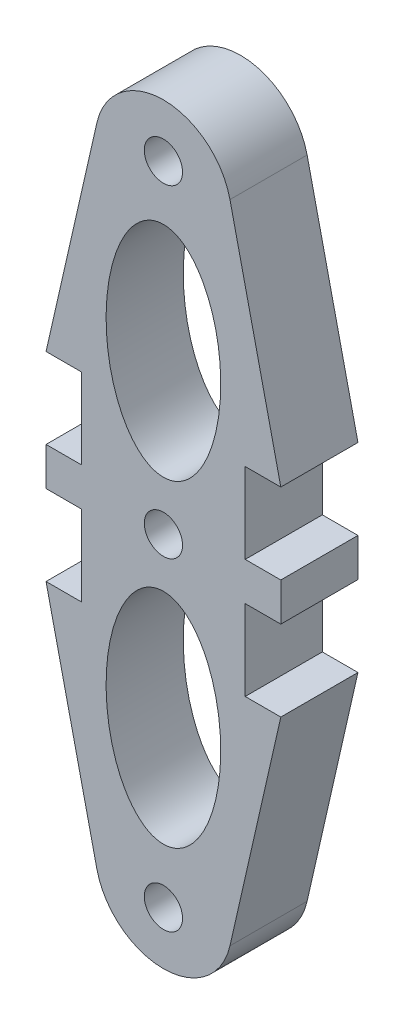
ISO-10303-21;
HEADER;
FILE_DESCRIPTION(('STEP AP214'),'2;1');
FILE_NAME('part.step','',(''),(''),'','','');
FILE_SCHEMA(('AUTOMOTIVE_DESIGN { 1 0 10303 214 1 1 1 1 }'));
ENDSEC;
DATA;
#1=APPLICATION_CONTEXT('core data for automotive mechanical design processes');
#2=APPLICATION_PROTOCOL_DEFINITION('international standard','automotive_design',2000,#1);
#3=PRODUCT_CONTEXT('',#1,'mechanical');
#4=PRODUCT('Part','Part','',(#3));
#5=PRODUCT_RELATED_PRODUCT_CATEGORY('part','',(#4));
#6=PRODUCT_DEFINITION_FORMATION('','',#4);
#7=PRODUCT_DEFINITION_CONTEXT('part definition',#1,'design');
#8=PRODUCT_DEFINITION('design','',#6,#7);
#9=PRODUCT_DEFINITION_SHAPE('','',#8);
#10=(LENGTH_UNIT() NAMED_UNIT(*) SI_UNIT(.MILLI.,.METRE.));
#11=(NAMED_UNIT(*) PLANE_ANGLE_UNIT() SI_UNIT($,.RADIAN.));
#12=(NAMED_UNIT(*) SI_UNIT($,.STERADIAN.) SOLID_ANGLE_UNIT());
#13=UNCERTAINTY_MEASURE_WITH_UNIT(LENGTH_MEASURE(1.E-05),#10,'distance_accuracy_value','');
#14=(GEOMETRIC_REPRESENTATION_CONTEXT(3) GLOBAL_UNCERTAINTY_ASSIGNED_CONTEXT((#13)) GLOBAL_UNIT_ASSIGNED_CONTEXT((#10,
#11,#12)) REPRESENTATION_CONTEXT('',''));
#15=CARTESIAN_POINT('',(0.,0.,0.));
#16=DIRECTION('',(0.,0.,1.));
#17=DIRECTION('',(1.,0.,0.));
#18=AXIS2_PLACEMENT_3D('',#15,#16,#17);
#19=CARTESIAN_POINT('',(839.03473715538,190.817587361382,5.85));
#20=DIRECTION('',(0.975100729071147,0.221762413778613,0.));
#21=DIRECTION('',(-0.221762413778613,0.975100729071147,0.));
#22=AXIS2_PLACEMENT_3D('',#19,#20,#21);
#23=PLANE('',#22);
#24=DIRECTION('',(0.221762413778613,-0.975100729071147,0.));
#25=VECTOR('',#24,1.);
#26=CARTESIAN_POINT('',(839.03473715538,190.817587361382,0.));
#27=LINE('',#26,#25);
#28=CARTESIAN_POINT('',(778.759168708765,455.852359196733,0.));
#29=VERTEX_POINT('',#28);
#30=CARTESIAN_POINT('',(782.614024726695,438.902359196733,0.));
#31=VERTEX_POINT('',#30);
#32=EDGE_CURVE('E324',#29,#31,#27,.T.);
#33=ORIENTED_EDGE('',*,*,#32,.T.);
#34=DIRECTION('',(0.,0.,-1.));
#35=VECTOR('',#34,1.);
#36=CARTESIAN_POINT('',(782.614024726695,438.902359196733,5.85));
#37=LINE('',#36,#35);
#38=CARTESIAN_POINT('',(782.614024726695,438.902359196733,5.85));
#39=VERTEX_POINT('',#38);
#40=EDGE_CURVE('E13',#39,#31,#37,.T.);
#41=ORIENTED_EDGE('',*,*,#40,.F.);
#42=DIRECTION('',(0.221762413778613,-0.975100729071147,0.));
#43=VECTOR('',#42,1.);
#44=CARTESIAN_POINT('',(839.03473715538,190.817587361382,5.85));
#45=LINE('',#44,#43);
#46=CARTESIAN_POINT('',(778.759168708765,455.852359196733,5.85));
#47=VERTEX_POINT('',#46);
#48=EDGE_CURVE('E479',#47,#39,#45,.T.);
#49=ORIENTED_EDGE('',*,*,#48,.F.);
#50=DIRECTION('',(0.,0.,-1.));
#51=VECTOR('',#50,1.);
#52=CARTESIAN_POINT('',(778.759168708765,455.852359196733,5.85));
#53=LINE('',#52,#51);
#54=EDGE_CURVE('E389',#47,#29,#53,.T.);
#55=ORIENTED_EDGE('',*,*,#54,.T.);
#56=EDGE_LOOP('',(#33,#41,#49,#55));
#57=FACE_BOUND('',#56,.T.);
#58=ADVANCED_FACE('F45',(#57),#23,.F.);
#59=CARTESIAN_POINT('',(787.659168708765,440.049751741901,5.85));
#60=DIRECTION('',(0.,0.,-1.));
#61=DIRECTION('',(-1.,0.,0.));
#62=AXIS2_PLACEMENT_3D('',#59,#60,#61);
#63=CYLINDRICAL_SURFACE('',#62,5.17397211555386);
#64=CARTESIAN_POINT('',(787.659168708765,440.049751741901,0.));
#65=DIRECTION('',(0.,0.,1.));
#66=DIRECTION('',(1.,0.,0.));
#67=AXIS2_PLACEMENT_3D('',#64,#65,#66);
#68=CIRCLE('',#67,5.17397211555386);
#69=CARTESIAN_POINT('',(792.704312690836,438.902359196733,0.));
#70=VERTEX_POINT('',#69);
#71=EDGE_CURVE('E328',#31,#70,#68,.T.);
#72=ORIENTED_EDGE('',*,*,#71,.T.);
#73=DIRECTION('',(0.,0.,-1.));
#74=VECTOR('',#73,1.);
#75=CARTESIAN_POINT('',(792.704312690836,438.902359196733,5.85));
#76=LINE('',#75,#74);
#77=CARTESIAN_POINT('',(792.704312690836,438.902359196733,5.85));
#78=VERTEX_POINT('',#77);
#79=EDGE_CURVE('E54',#78,#70,#76,.T.);
#80=ORIENTED_EDGE('',*,*,#79,.F.);
#81=CARTESIAN_POINT('',(787.659168708765,440.049751741901,5.85));
#82=DIRECTION('',(0.,0.,1.));
#83=DIRECTION('',(1.,0.,0.));
#84=AXIS2_PLACEMENT_3D('',#81,#82,#83);
#85=CIRCLE('',#84,5.17397211555386);
#86=EDGE_CURVE('E140',#39,#78,#85,.T.);
#87=ORIENTED_EDGE('',*,*,#86,.F.);
#88=ORIENTED_EDGE('',*,*,#40,.T.);
#89=EDGE_LOOP('',(#72,#80,#87,#88));
#90=FACE_BOUND('',#89,.T.);
#91=ADVANCED_FACE('F304',(#90),#63,.T.);
#92=CARTESIAN_POINT('',(658.81170002402,-149.830339027732,5.85));
#93=DIRECTION('',(-0.975100729071147,0.221762413778613,0.));
#94=DIRECTION('',(-0.221762413778613,-0.975100729071147,0.));
#95=AXIS2_PLACEMENT_3D('',#92,#93,#94);
#96=PLANE('',#95);
#97=DIRECTION('',(0.221762413778613,0.975100729071147,0.));
#98=VECTOR('',#97,1.);
#99=CARTESIAN_POINT('',(658.81170002402,-149.830339027732,0.));
#100=LINE('',#99,#98);
#101=CARTESIAN_POINT('',(796.559168708765,455.852359196733,0.));
#102=VERTEX_POINT('',#101);
#103=EDGE_CURVE('E333',#70,#102,#100,.T.);
#104=ORIENTED_EDGE('',*,*,#103,.T.);
#105=DIRECTION('',(0.,0.,-1.));
#106=VECTOR('',#105,1.);
#107=CARTESIAN_POINT('',(796.559168708765,455.852359196733,5.85));
#108=LINE('',#107,#106);
#109=CARTESIAN_POINT('',(796.559168708765,455.852359196733,5.85));
#110=VERTEX_POINT('',#109);
#111=EDGE_CURVE('E421',#110,#102,#108,.T.);
#112=ORIENTED_EDGE('',*,*,#111,.F.);
#113=DIRECTION('',(0.221762413778613,0.975100729071147,0.));
#114=VECTOR('',#113,1.);
#115=CARTESIAN_POINT('',(658.81170002402,-149.830339027732,5.85));
#116=LINE('',#115,#114);
#117=EDGE_CURVE('E426',#78,#110,#116,.T.);
#118=ORIENTED_EDGE('',*,*,#117,.F.);
#119=ORIENTED_EDGE('',*,*,#79,.T.);
#120=EDGE_LOOP('',(#104,#112,#118,#119));
#121=FACE_BOUND('',#120,.T.);
#122=ADVANCED_FACE('F300',(#121),#96,.F.);
#123=CARTESIAN_POINT('',(9.37218120388744E-12,455.852359196749,5.85));
#124=DIRECTION('',(0.,1.,0.));
#125=DIRECTION('',(-1.,0.,0.));
#126=AXIS2_PLACEMENT_3D('',#123,#124,#125);
#127=PLANE('',#126);
#128=DIRECTION('',(1.,0.,0.));
#129=VECTOR('',#128,1.);
#130=CARTESIAN_POINT('',(9.37218120388744E-12,455.852359196749,0.));
#131=LINE('',#130,#129);
#132=CARTESIAN_POINT('',(793.859168708765,455.852359196733,0.));
#133=VERTEX_POINT('',#132);
#134=EDGE_CURVE('E336',#133,#102,#131,.T.);
#135=ORIENTED_EDGE('',*,*,#134,.F.);
#136=DIRECTION('',(0.,0.,-1.));
#137=VECTOR('',#136,1.);
#138=CARTESIAN_POINT('',(793.859168708765,455.852359196733,5.85));
#139=LINE('',#138,#137);
#140=CARTESIAN_POINT('',(793.859168708765,455.852359196733,5.85));
#141=VERTEX_POINT('',#140);
#142=EDGE_CURVE('E419',#141,#133,#139,.T.);
#143=ORIENTED_EDGE('',*,*,#142,.F.);
#144=DIRECTION('',(1.,0.,0.));
#145=VECTOR('',#144,1.);
#146=CARTESIAN_POINT('',(9.37218120388744E-12,455.852359196749,5.85));
#147=LINE('',#146,#145);
#148=EDGE_CURVE('E436',#141,#110,#147,.T.);
#149=ORIENTED_EDGE('',*,*,#148,.T.);
#150=ORIENTED_EDGE('',*,*,#111,.T.);
#151=EDGE_LOOP('',(#135,#143,#149,#150));
#152=FACE_BOUND('',#151,.T.);
#153=ADVANCED_FACE('F296',(#152),#127,.T.);
#154=CARTESIAN_POINT('',(793.859168708765,0.,5.85));
#155=DIRECTION('',(1.,0.,0.));
#156=DIRECTION('',(0.,0.,-1.));
#157=AXIS2_PLACEMENT_3D('',#154,#155,#156);
#158=PLANE('',#157);
#159=DIRECTION('',(0.,-1.,0.));
#160=VECTOR('',#159,1.);
#161=CARTESIAN_POINT('',(793.859168708765,0.,0.));
#162=LINE('',#161,#160);
#163=CARTESIAN_POINT('',(793.859168708765,461.952359196733,0.));
#164=VERTEX_POINT('',#163);
#165=EDGE_CURVE('E339',#164,#133,#162,.T.);
#166=ORIENTED_EDGE('',*,*,#165,.F.);
#167=DIRECTION('',(0.,0.,-1.));
#168=VECTOR('',#167,1.);
#169=CARTESIAN_POINT('',(793.859168708765,461.952359196733,5.85));
#170=LINE('',#169,#168);
#171=CARTESIAN_POINT('',(793.859168708765,461.952359196733,5.85));
#172=VERTEX_POINT('',#171);
#173=EDGE_CURVE('E417',#172,#164,#170,.T.);
#174=ORIENTED_EDGE('',*,*,#173,.F.);
#175=DIRECTION('',(0.,-1.,0.));
#176=VECTOR('',#175,1.);
#177=CARTESIAN_POINT('',(793.859168708765,0.,5.85));
#178=LINE('',#177,#176);
#179=EDGE_CURVE('E439',#172,#141,#178,.T.);
#180=ORIENTED_EDGE('',*,*,#179,.T.);
#181=ORIENTED_EDGE('',*,*,#142,.T.);
#182=EDGE_LOOP('',(#166,#174,#180,#181));
#183=FACE_BOUND('',#182,.T.);
#184=ADVANCED_FACE('F292',(#183),#158,.T.);
#185=CARTESIAN_POINT('',(9.4975952862988E-12,461.952359196749,5.85));
#186=DIRECTION('',(0.,1.,0.));
#187=DIRECTION('',(-1.,0.,0.));
#188=AXIS2_PLACEMENT_3D('',#185,#186,#187);
#189=PLANE('',#188);
#190=DIRECTION('',(1.,0.,0.));
#191=VECTOR('',#190,1.);
#192=CARTESIAN_POINT('',(9.4975952862988E-12,461.952359196749,0.));
#193=LINE('',#192,#191);
#194=CARTESIAN_POINT('',(796.559168708765,461.952359196733,0.));
#195=VERTEX_POINT('',#194);
#196=EDGE_CURVE('E342',#164,#195,#193,.T.);
#197=ORIENTED_EDGE('',*,*,#196,.T.);
#198=DIRECTION('',(0.,0.,-1.));
#199=VECTOR('',#198,1.);
#200=CARTESIAN_POINT('',(796.559168708765,461.952359196733,5.85));
#201=LINE('',#200,#199);
#202=CARTESIAN_POINT('',(796.559168708765,461.952359196733,5.85));
#203=VERTEX_POINT('',#202);
#204=EDGE_CURVE('E415',#203,#195,#201,.T.);
#205=ORIENTED_EDGE('',*,*,#204,.F.);
#206=DIRECTION('',(1.,0.,0.));
#207=VECTOR('',#206,1.);
#208=CARTESIAN_POINT('',(9.4975952862988E-12,461.952359196749,5.85));
#209=LINE('',#208,#207);
#210=EDGE_CURVE('E441',#172,#203,#209,.T.);
#211=ORIENTED_EDGE('',*,*,#210,.F.);
#212=ORIENTED_EDGE('',*,*,#173,.T.);
#213=EDGE_LOOP('',(#197,#205,#211,#212));
#214=FACE_BOUND('',#213,.T.);
#215=ADVANCED_FACE('F288',(#214),#189,.F.);
#216=CARTESIAN_POINT('',(796.559168708765,0.,5.85));
#217=DIRECTION('',(1.,0.,0.));
#218=DIRECTION('',(0.,0.,-1.));
#219=AXIS2_PLACEMENT_3D('',#216,#217,#218);
#220=PLANE('',#219);
#221=DIRECTION('',(0.,-1.,0.));
#222=VECTOR('',#221,1.);
#223=CARTESIAN_POINT('',(796.559168708765,0.,0.));
#224=LINE('',#223,#222);
#225=CARTESIAN_POINT('',(796.559168708765,464.852359196733,0.));
#226=VERTEX_POINT('',#225);
#227=EDGE_CURVE('E345',#226,#195,#224,.T.);
#228=ORIENTED_EDGE('',*,*,#227,.F.);
#229=DIRECTION('',(0.,0.,-1.));
#230=VECTOR('',#229,1.);
#231=CARTESIAN_POINT('',(796.559168708765,464.852359196733,5.85));
#232=LINE('',#231,#230);
#233=CARTESIAN_POINT('',(796.559168708765,464.852359196733,5.85));
#234=VERTEX_POINT('',#233);
#235=EDGE_CURVE('E413',#234,#226,#232,.T.);
#236=ORIENTED_EDGE('',*,*,#235,.F.);
#237=DIRECTION('',(0.,-1.,0.));
#238=VECTOR('',#237,1.);
#239=CARTESIAN_POINT('',(796.559168708765,0.,5.85));
#240=LINE('',#239,#238);
#241=EDGE_CURVE('E447',#234,#203,#240,.T.);
#242=ORIENTED_EDGE('',*,*,#241,.T.);
#243=ORIENTED_EDGE('',*,*,#204,.T.);
#244=EDGE_LOOP('',(#228,#236,#242,#243));
#245=FACE_BOUND('',#244,.T.);
#246=ADVANCED_FACE('F284',(#245),#220,.T.);
#247=CARTESIAN_POINT('',(-9.55721837465762E-12,464.852359196716,5.85));
#248=DIRECTION('',(0.,1.,0.));
#249=DIRECTION('',(-1.,0.,0.));
#250=AXIS2_PLACEMENT_3D('',#247,#248,#249);
#251=PLANE('',#250);
#252=DIRECTION('',(1.,0.,0.));
#253=VECTOR('',#252,1.);
#254=CARTESIAN_POINT('',(-9.55721837465762E-12,464.852359196716,0.));
#255=LINE('',#254,#253);
#256=CARTESIAN_POINT('',(793.859168708765,464.852359196733,0.));
#257=VERTEX_POINT('',#256);
#258=EDGE_CURVE('E348',#257,#226,#255,.T.);
#259=ORIENTED_EDGE('',*,*,#258,.F.);
#260=DIRECTION('',(0.,0.,-1.));
#261=VECTOR('',#260,1.);
#262=CARTESIAN_POINT('',(793.859168708765,464.852359196733,5.85));
#263=LINE('',#262,#261);
#264=CARTESIAN_POINT('',(793.859168708765,464.852359196733,5.85));
#265=VERTEX_POINT('',#264);
#266=EDGE_CURVE('E411',#265,#257,#263,.T.);
#267=ORIENTED_EDGE('',*,*,#266,.F.);
#268=DIRECTION('',(1.,0.,0.));
#269=VECTOR('',#268,1.);
#270=CARTESIAN_POINT('',(-9.55721837465762E-12,464.852359196716,5.85));
#271=LINE('',#270,#269);
#272=EDGE_CURVE('E450',#265,#234,#271,.T.);
#273=ORIENTED_EDGE('',*,*,#272,.T.);
#274=ORIENTED_EDGE('',*,*,#235,.T.);
#275=EDGE_LOOP('',(#259,#267,#273,#274));
#276=FACE_BOUND('',#275,.T.);
#277=ADVANCED_FACE('F280',(#276),#251,.T.);
#278=CARTESIAN_POINT('',(793.859168708765,0.,5.85));
#279=DIRECTION('',(-1.,0.,0.));
#280=DIRECTION('',(0.,0.,1.));
#281=AXIS2_PLACEMENT_3D('',#278,#279,#280);
#282=PLANE('',#281);
#283=DIRECTION('',(0.,1.,0.));
#284=VECTOR('',#283,1.);
#285=CARTESIAN_POINT('',(793.859168708765,0.,0.));
#286=LINE('',#285,#284);
#287=CARTESIAN_POINT('',(793.859168708765,470.952359196733,0.));
#288=VERTEX_POINT('',#287);
#289=EDGE_CURVE('E351',#257,#288,#286,.T.);
#290=ORIENTED_EDGE('',*,*,#289,.T.);
#291=DIRECTION('',(0.,0.,-1.));
#292=VECTOR('',#291,1.);
#293=CARTESIAN_POINT('',(793.859168708765,470.952359196733,5.85));
#294=LINE('',#293,#292);
#295=CARTESIAN_POINT('',(793.859168708765,470.952359196733,5.85));
#296=VERTEX_POINT('',#295);
#297=EDGE_CURVE('E408',#296,#288,#294,.T.);
#298=ORIENTED_EDGE('',*,*,#297,.F.);
#299=DIRECTION('',(0.,1.,0.));
#300=VECTOR('',#299,1.);
#301=CARTESIAN_POINT('',(793.859168708765,0.,5.85));
#302=LINE('',#301,#300);
#303=EDGE_CURVE('E453',#265,#296,#302,.T.);
#304=ORIENTED_EDGE('',*,*,#303,.F.);
#305=ORIENTED_EDGE('',*,*,#266,.T.);
#306=EDGE_LOOP('',(#290,#298,#304,#305));
#307=FACE_BOUND('',#306,.T.);
#308=ADVANCED_FACE('F276',(#307),#282,.F.);
#309=CARTESIAN_POINT('',(-9.68263245706898E-12,470.952359196717,5.85));
#310=DIRECTION('',(0.,1.,0.));
#311=DIRECTION('',(-1.,0.,0.));
#312=AXIS2_PLACEMENT_3D('',#309,#310,#311);
#313=PLANE('',#312);
#314=DIRECTION('',(1.,0.,0.));
#315=VECTOR('',#314,1.);
#316=CARTESIAN_POINT('',(-9.68263245706898E-12,470.952359196717,0.));
#317=LINE('',#316,#315);
#318=CARTESIAN_POINT('',(796.559168708765,470.952359196733,0.));
#319=VERTEX_POINT('',#318);
#320=EDGE_CURVE('E353',#288,#319,#317,.T.);
#321=ORIENTED_EDGE('',*,*,#320,.T.);
#322=DIRECTION('',(0.,0.,-1.));
#323=VECTOR('',#322,1.);
#324=CARTESIAN_POINT('',(796.559168708765,470.952359196733,5.85));
#325=LINE('',#324,#323);
#326=CARTESIAN_POINT('',(796.559168708765,470.952359196733,5.85));
#327=VERTEX_POINT('',#326);
#328=EDGE_CURVE('E406',#327,#319,#325,.T.);
#329=ORIENTED_EDGE('',*,*,#328,.F.);
#330=DIRECTION('',(1.,0.,0.));
#331=VECTOR('',#330,1.);
#332=CARTESIAN_POINT('',(-9.68263245706898E-12,470.952359196717,5.85));
#333=LINE('',#332,#331);
#334=EDGE_CURVE('E455',#296,#327,#333,.T.);
#335=ORIENTED_EDGE('',*,*,#334,.F.);
#336=ORIENTED_EDGE('',*,*,#297,.T.);
#337=EDGE_LOOP('',(#321,#329,#335,#336));
#338=FACE_BOUND('',#337,.T.);
#339=ADVANCED_FACE('F272',(#338),#313,.F.);
#340=CARTESIAN_POINT('',(859.224593081521,195.409268046813,5.85));
#341=DIRECTION('',(0.975100729071147,0.221762413778615,0.));
#342=DIRECTION('',(-0.221762413778615,0.975100729071147,0.));
#343=AXIS2_PLACEMENT_3D('',#340,#341,#342);
#344=PLANE('',#343);
#345=DIRECTION('',(0.221762413778615,-0.975100729071147,0.));
#346=VECTOR('',#345,1.);
#347=CARTESIAN_POINT('',(859.224593081521,195.409268046813,0.));
#348=LINE('',#347,#346);
#349=CARTESIAN_POINT('',(792.704312690836,487.902359196733,0.));
#350=VERTEX_POINT('',#349);
#351=EDGE_CURVE('E356',#350,#319,#348,.T.);
#352=ORIENTED_EDGE('',*,*,#351,.F.);
#353=DIRECTION('',(0.,0.,-1.));
#354=VECTOR('',#353,1.);
#355=CARTESIAN_POINT('',(792.704312690836,487.902359196733,5.85));
#356=LINE('',#355,#354);
#357=CARTESIAN_POINT('',(792.704312690836,487.902359196733,5.85));
#358=VERTEX_POINT('',#357);
#359=EDGE_CURVE('E404',#358,#350,#356,.T.);
#360=ORIENTED_EDGE('',*,*,#359,.F.);
#361=DIRECTION('',(0.221762413778615,-0.975100729071147,0.));
#362=VECTOR('',#361,1.);
#363=CARTESIAN_POINT('',(859.224593081521,195.409268046813,5.85));
#364=LINE('',#363,#362);
#365=EDGE_CURVE('E457',#358,#327,#364,.T.);
#366=ORIENTED_EDGE('',*,*,#365,.T.);
#367=ORIENTED_EDGE('',*,*,#328,.T.);
#368=EDGE_LOOP('',(#352,#360,#366,#367));
#369=FACE_BOUND('',#368,.T.);
#370=ADVANCED_FACE('F268',(#369),#344,.T.);
#371=CARTESIAN_POINT('',(787.659168708765,486.754966651564,5.85));
#372=DIRECTION('',(0.,0.,-1.));
#373=DIRECTION('',(-1.,0.,0.));
#374=AXIS2_PLACEMENT_3D('',#371,#372,#373);
#375=CYLINDRICAL_SURFACE('',#374,5.17397211555386);
#376=CARTESIAN_POINT('',(787.659168708765,486.754966651564,0.));
#377=DIRECTION('',(0.,0.,1.));
#378=DIRECTION('',(1.,0.,0.));
#379=AXIS2_PLACEMENT_3D('',#376,#377,#378);
#380=CIRCLE('',#379,5.17397211555386);
#381=CARTESIAN_POINT('',(782.614024726695,487.902359196733,0.));
#382=VERTEX_POINT('',#381);
#383=EDGE_CURVE('E359',#382,#350,#380,.F.);
#384=ORIENTED_EDGE('',*,*,#383,.F.);
#385=DIRECTION('',(0.,0.,-1.));
#386=VECTOR('',#385,1.);
#387=CARTESIAN_POINT('',(782.614024726695,487.902359196733,5.85));
#388=LINE('',#387,#386);
#389=CARTESIAN_POINT('',(782.614024726695,487.902359196733,5.85));
#390=VERTEX_POINT('',#389);
#391=EDGE_CURVE('E402',#390,#382,#388,.T.);
#392=ORIENTED_EDGE('',*,*,#391,.F.);
#393=CARTESIAN_POINT('',(787.659168708765,486.754966651564,5.85));
#394=DIRECTION('',(0.,0.,1.));
#395=DIRECTION('',(1.,0.,0.));
#396=AXIS2_PLACEMENT_3D('',#393,#394,#395);
#397=CIRCLE('',#396,5.17397211555386);
#398=EDGE_CURVE('E460',#390,#358,#397,.F.);
#399=ORIENTED_EDGE('',*,*,#398,.T.);
#400=ORIENTED_EDGE('',*,*,#359,.T.);
#401=EDGE_LOOP('',(#384,#392,#399,#400));
#402=FACE_BOUND('',#401,.T.);
#403=ADVANCED_FACE('F264',(#402),#375,.T.);
#404=CARTESIAN_POINT('',(638.621844097877,-145.238658342303,5.85));
#405=DIRECTION('',(-0.975100729071147,0.221762413778615,0.));
#406=DIRECTION('',(-0.221762413778615,-0.975100729071147,0.));
#407=AXIS2_PLACEMENT_3D('',#404,#405,#406);
#408=PLANE('',#407);
#409=DIRECTION('',(0.221762413778615,0.975100729071147,0.));
#410=VECTOR('',#409,1.);
#411=CARTESIAN_POINT('',(638.621844097877,-145.238658342303,0.));
#412=LINE('',#411,#410);
#413=CARTESIAN_POINT('',(778.759168708765,470.952359196733,0.));
#414=VERTEX_POINT('',#413);
#415=EDGE_CURVE('E362',#414,#382,#412,.T.);
#416=ORIENTED_EDGE('',*,*,#415,.F.);
#417=DIRECTION('',(0.,0.,-1.));
#418=VECTOR('',#417,1.);
#419=CARTESIAN_POINT('',(778.759168708765,470.952359196733,5.85));
#420=LINE('',#419,#418);
#421=CARTESIAN_POINT('',(778.759168708765,470.952359196733,5.85));
#422=VERTEX_POINT('',#421);
#423=EDGE_CURVE('E400',#422,#414,#420,.T.);
#424=ORIENTED_EDGE('',*,*,#423,.F.);
#425=DIRECTION('',(0.221762413778615,0.975100729071147,0.));
#426=VECTOR('',#425,1.);
#427=CARTESIAN_POINT('',(638.621844097877,-145.238658342303,5.85));
#428=LINE('',#427,#426);
#429=EDGE_CURVE('E463',#422,#390,#428,.T.);
#430=ORIENTED_EDGE('',*,*,#429,.T.);
#431=ORIENTED_EDGE('',*,*,#391,.T.);
#432=EDGE_LOOP('',(#416,#424,#430,#431));
#433=FACE_BOUND('',#432,.T.);
#434=ADVANCED_FACE('F260',(#433),#408,.T.);
#435=CARTESIAN_POINT('',(9.68263245706964E-12,470.952359196749,5.85));
#436=DIRECTION('',(0.,-1.,0.));
#437=DIRECTION('',(1.,0.,0.));
#438=AXIS2_PLACEMENT_3D('',#435,#436,#437);
#439=PLANE('',#438);
#440=DIRECTION('',(-1.,0.,0.));
#441=VECTOR('',#440,1.);
#442=CARTESIAN_POINT('',(9.68263245706964E-12,470.952359196749,0.));
#443=LINE('',#442,#441);
#444=CARTESIAN_POINT('',(781.459168708765,470.952359196733,0.));
#445=VERTEX_POINT('',#444);
#446=EDGE_CURVE('E365',#445,#414,#443,.T.);
#447=ORIENTED_EDGE('',*,*,#446,.F.);
#448=DIRECTION('',(0.,0.,-1.));
#449=VECTOR('',#448,1.);
#450=CARTESIAN_POINT('',(781.459168708765,470.952359196733,5.85));
#451=LINE('',#450,#449);
#452=CARTESIAN_POINT('',(781.459168708765,470.952359196733,5.85));
#453=VERTEX_POINT('',#452);
#454=EDGE_CURVE('E398',#453,#445,#451,.T.);
#455=ORIENTED_EDGE('',*,*,#454,.F.);
#456=DIRECTION('',(-1.,0.,0.));
#457=VECTOR('',#456,1.);
#458=CARTESIAN_POINT('',(9.68263245706964E-12,470.952359196749,5.85));
#459=LINE('',#458,#457);
#460=EDGE_CURVE('E466',#453,#422,#459,.T.);
#461=ORIENTED_EDGE('',*,*,#460,.T.);
#462=ORIENTED_EDGE('',*,*,#423,.T.);
#463=EDGE_LOOP('',(#447,#455,#461,#462));
#464=FACE_BOUND('',#463,.T.);
#465=ADVANCED_FACE('F256',(#464),#439,.T.);
#466=CARTESIAN_POINT('',(781.459168708765,0.,5.85));
#467=DIRECTION('',(-1.,0.,0.));
#468=DIRECTION('',(0.,0.,1.));
#469=AXIS2_PLACEMENT_3D('',#466,#467,#468);
#470=PLANE('',#469);
#471=DIRECTION('',(0.,1.,0.));
#472=VECTOR('',#471,1.);
#473=CARTESIAN_POINT('',(781.459168708765,0.,0.));
#474=LINE('',#473,#472);
#475=CARTESIAN_POINT('',(781.459168708765,464.852359196733,0.));
#476=VERTEX_POINT('',#475);
#477=EDGE_CURVE('E368',#476,#445,#474,.T.);
#478=ORIENTED_EDGE('',*,*,#477,.F.);
#479=DIRECTION('',(0.,0.,-1.));
#480=VECTOR('',#479,1.);
#481=CARTESIAN_POINT('',(781.459168708765,464.852359196733,5.85));
#482=LINE('',#481,#480);
#483=CARTESIAN_POINT('',(781.459168708765,464.852359196733,5.85));
#484=VERTEX_POINT('',#483);
#485=EDGE_CURVE('E396',#484,#476,#482,.T.);
#486=ORIENTED_EDGE('',*,*,#485,.F.);
#487=DIRECTION('',(0.,1.,0.));
#488=VECTOR('',#487,1.);
#489=CARTESIAN_POINT('',(781.459168708765,0.,5.85));
#490=LINE('',#489,#488);
#491=EDGE_CURVE('E469',#484,#453,#490,.T.);
#492=ORIENTED_EDGE('',*,*,#491,.T.);
#493=ORIENTED_EDGE('',*,*,#454,.T.);
#494=EDGE_LOOP('',(#478,#486,#492,#493));
#495=FACE_BOUND('',#494,.T.);
#496=ADVANCED_FACE('F252',(#495),#470,.T.);
#497=CARTESIAN_POINT('',(9.55721837465828E-12,464.852359196749,5.85));
#498=DIRECTION('',(0.,-1.,0.));
#499=DIRECTION('',(1.,0.,0.));
#500=AXIS2_PLACEMENT_3D('',#497,#498,#499);
#501=PLANE('',#500);
#502=DIRECTION('',(-1.,0.,0.));
#503=VECTOR('',#502,1.);
#504=CARTESIAN_POINT('',(9.55721837465828E-12,464.852359196749,0.));
#505=LINE('',#504,#503);
#506=CARTESIAN_POINT('',(778.759168708765,464.852359196733,0.));
#507=VERTEX_POINT('',#506);
#508=EDGE_CURVE('E371',#476,#507,#505,.T.);
#509=ORIENTED_EDGE('',*,*,#508,.T.);
#510=DIRECTION('',(0.,0.,-1.));
#511=VECTOR('',#510,1.);
#512=CARTESIAN_POINT('',(778.759168708765,464.852359196733,5.85));
#513=LINE('',#512,#511);
#514=CARTESIAN_POINT('',(778.759168708765,464.852359196733,5.85));
#515=VERTEX_POINT('',#514);
#516=EDGE_CURVE('E393',#515,#507,#513,.T.);
#517=ORIENTED_EDGE('',*,*,#516,.F.);
#518=DIRECTION('',(-1.,0.,0.));
#519=VECTOR('',#518,1.);
#520=CARTESIAN_POINT('',(9.55721837465828E-12,464.852359196749,5.85));
#521=LINE('',#520,#519);
#522=EDGE_CURVE('E210',#484,#515,#521,.T.);
#523=ORIENTED_EDGE('',*,*,#522,.F.);
#524=ORIENTED_EDGE('',*,*,#485,.T.);
#525=EDGE_LOOP('',(#509,#517,#523,#524));
#526=FACE_BOUND('',#525,.T.);
#527=ADVANCED_FACE('F248',(#526),#501,.F.);
#528=CARTESIAN_POINT('',(778.759168708765,0.,5.85));
#529=DIRECTION('',(1.,0.,0.));
#530=DIRECTION('',(0.,0.,-1.));
#531=AXIS2_PLACEMENT_3D('',#528,#529,#530);
#532=PLANE('',#531);
#533=DIRECTION('',(0.,-1.,0.));
#534=VECTOR('',#533,1.);
#535=CARTESIAN_POINT('',(778.759168708765,0.,0.));
#536=LINE('',#535,#534);
#537=CARTESIAN_POINT('',(778.759168708765,461.952359196733,0.));
#538=VERTEX_POINT('',#537);
#539=EDGE_CURVE('E373',#507,#538,#536,.T.);
#540=ORIENTED_EDGE('',*,*,#539,.T.);
#541=DIRECTION('',(0.,0.,-1.));
#542=VECTOR('',#541,1.);
#543=CARTESIAN_POINT('',(778.759168708765,461.952359196733,5.85));
#544=LINE('',#543,#542);
#545=CARTESIAN_POINT('',(778.759168708765,461.952359196733,5.85));
#546=VERTEX_POINT('',#545);
#547=EDGE_CURVE('E198',#546,#538,#544,.T.);
#548=ORIENTED_EDGE('',*,*,#547,.F.);
#549=DIRECTION('',(0.,-1.,0.));
#550=VECTOR('',#549,1.);
#551=CARTESIAN_POINT('',(778.759168708765,0.,5.85));
#552=LINE('',#551,#550);
#553=EDGE_CURVE('E207',#515,#546,#552,.T.);
#554=ORIENTED_EDGE('',*,*,#553,.F.);
#555=ORIENTED_EDGE('',*,*,#516,.T.);
#556=EDGE_LOOP('',(#540,#548,#554,#555));
#557=FACE_BOUND('',#556,.T.);
#558=ADVANCED_FACE('F245',(#557),#532,.F.);
#559=CARTESIAN_POINT('',(-9.49759528629813E-12,461.952359196717,5.85));
#560=DIRECTION('',(0.,-1.,0.));
#561=DIRECTION('',(1.,0.,0.));
#562=AXIS2_PLACEMENT_3D('',#559,#560,#561);
#563=PLANE('',#562);
#564=DIRECTION('',(-1.,0.,0.));
#565=VECTOR('',#564,1.);
#566=CARTESIAN_POINT('',(-9.49759528629813E-12,461.952359196717,0.));
#567=LINE('',#566,#565);
#568=CARTESIAN_POINT('',(781.459168708765,461.952359196733,0.));
#569=VERTEX_POINT('',#568);
#570=EDGE_CURVE('E197',#569,#538,#567,.T.);
#571=ORIENTED_EDGE('',*,*,#570,.F.);
#572=DIRECTION('',(0.,0.,-1.));
#573=VECTOR('',#572,1.);
#574=CARTESIAN_POINT('',(781.459168708765,461.952359196733,5.85));
#575=LINE('',#574,#573);
#576=CARTESIAN_POINT('',(781.459168708765,461.952359196733,5.85));
#577=VERTEX_POINT('',#576);
#578=EDGE_CURVE('E191',#577,#569,#575,.T.);
#579=ORIENTED_EDGE('',*,*,#578,.F.);
#580=DIRECTION('',(-1.,0.,0.));
#581=VECTOR('',#580,1.);
#582=CARTESIAN_POINT('',(-9.49759528629813E-12,461.952359196717,5.85));
#583=LINE('',#582,#581);
#584=EDGE_CURVE('E195',#577,#546,#583,.T.);
#585=ORIENTED_EDGE('',*,*,#584,.T.);
#586=ORIENTED_EDGE('',*,*,#547,.T.);
#587=EDGE_LOOP('',(#571,#579,#585,#586));
#588=FACE_BOUND('',#587,.T.);
#589=ADVANCED_FACE('F193',(#588),#563,.T.);
#590=CARTESIAN_POINT('',(781.459168708765,0.,5.85));
#591=DIRECTION('',(1.,0.,0.));
#592=DIRECTION('',(0.,0.,-1.));
#593=AXIS2_PLACEMENT_3D('',#590,#591,#592);
#594=PLANE('',#593);
#595=DIRECTION('',(0.,-1.,0.));
#596=VECTOR('',#595,1.);
#597=CARTESIAN_POINT('',(781.459168708765,0.,0.));
#598=LINE('',#597,#596);
#599=CARTESIAN_POINT('',(781.459168708765,455.852359196733,0.));
#600=VERTEX_POINT('',#599);
#601=EDGE_CURVE('E126',#569,#600,#598,.T.);
#602=ORIENTED_EDGE('',*,*,#601,.T.);
#603=DIRECTION('',(0.,0.,-1.));
#604=VECTOR('',#603,1.);
#605=CARTESIAN_POINT('',(781.459168708765,455.852359196733,5.85));
#606=LINE('',#605,#604);
#607=CARTESIAN_POINT('',(781.459168708765,455.852359196733,5.85));
#608=VERTEX_POINT('',#607);
#609=EDGE_CURVE('E199',#608,#600,#606,.T.);
#610=ORIENTED_EDGE('',*,*,#609,.F.);
#611=DIRECTION('',(0.,-1.,0.));
#612=VECTOR('',#611,1.);
#613=CARTESIAN_POINT('',(781.459168708765,0.,5.85));
#614=LINE('',#613,#612);
#615=EDGE_CURVE('E201',#577,#608,#614,.T.);
#616=ORIENTED_EDGE('',*,*,#615,.F.);
#617=ORIENTED_EDGE('',*,*,#578,.T.);
#618=EDGE_LOOP('',(#602,#610,#616,#617));
#619=FACE_BOUND('',#618,.T.);
#620=ADVANCED_FACE('F202',(#619),#594,.F.);
#621=CARTESIAN_POINT('',(787.659168708765,475.44811823758,5.85));
#622=DIRECTION('',(0.,0.,1.));
#623=DIRECTION('',(0.,1.,0.));
#624=AXIS2_PLACEMENT_3D('',#621,#622,#623);
#625=ELLIPSE('',#624,8.30208055455728,4.34649741649051);
#626=DIRECTION('',(0.,0.,-1.));
#627=VECTOR('',#626,1.);
#628=SURFACE_OF_LINEAR_EXTRUSION('',#625,#627);
#629=CARTESIAN_POINT('',(787.659168708765,483.750198792137,5.85));
#630=VERTEX_POINT('',#629);
#631=EDGE_CURVE('E218',#630,#630,#625,.T.);
#632=ORIENTED_EDGE('',*,*,#631,.T.);
#633=EDGE_LOOP('',(#632));
#634=FACE_BOUND('',#633,.T.);
#635=CARTESIAN_POINT('',(787.659168708765,475.44811823758,0.));
#636=DIRECTION('',(0.,0.,1.));
#637=DIRECTION('',(0.,1.,0.));
#638=AXIS2_PLACEMENT_3D('',#635,#636,#637);
#639=ELLIPSE('',#638,8.30208055455728,4.34649741649051);
#640=CARTESIAN_POINT('',(787.659168708765,483.750198792137,0.));
#641=VERTEX_POINT('',#640);
#642=EDGE_CURVE('E382',#641,#641,#639,.T.);
#643=ORIENTED_EDGE('',*,*,#642,.F.);
#644=EDGE_LOOP('',(#643));
#645=FACE_BOUND('',#644,.T.);
#646=ADVANCED_FACE('F226',(#634,#645),#628,.T.);
#647=CARTESIAN_POINT('',(787.659168708765,463.402359196733,5.85));
#648=DIRECTION('',(0.,0.,-1.));
#649=DIRECTION('',(-1.,0.,0.));
#650=AXIS2_PLACEMENT_3D('',#647,#648,#649);
#651=CYLINDRICAL_SURFACE('',#650,1.44999999999994);
#652=CARTESIAN_POINT('',(787.659168708765,463.402359196733,5.85));
#653=DIRECTION('',(0.,0.,1.));
#654=DIRECTION('',(1.,0.,0.));
#655=AXIS2_PLACEMENT_3D('',#652,#653,#654);
#656=CIRCLE('',#655,1.44999999999994);
#657=CARTESIAN_POINT('',(789.109168708765,463.402359196733,5.85));
#658=VERTEX_POINT('',#657);
#659=EDGE_CURVE('E215',#658,#658,#656,.T.);
#660=ORIENTED_EDGE('',*,*,#659,.T.);
#661=EDGE_LOOP('',(#660));
#662=FACE_BOUND('',#661,.T.);
#663=CARTESIAN_POINT('',(787.659168708765,463.402359196733,0.));
#664=DIRECTION('',(0.,0.,1.));
#665=DIRECTION('',(1.,0.,0.));
#666=AXIS2_PLACEMENT_3D('',#663,#664,#665);
#667=CIRCLE('',#666,1.44999999999994);
#668=CARTESIAN_POINT('',(789.109168708765,463.402359196733,0.));
#669=VERTEX_POINT('',#668);
#670=EDGE_CURVE('E379',#669,#669,#667,.T.);
#671=ORIENTED_EDGE('',*,*,#670,.F.);
#672=EDGE_LOOP('',(#671));
#673=FACE_BOUND('',#672,.T.);
#674=ADVANCED_FACE('F230',(#662,#673),#651,.F.);
#675=CARTESIAN_POINT('',(-9.37218120388677E-12,455.852359196717,5.85));
#676=DIRECTION('',(0.,-1.,0.));
#677=DIRECTION('',(1.,0.,0.));
#678=AXIS2_PLACEMENT_3D('',#675,#676,#677);
#679=PLANE('',#678);
#680=DIRECTION('',(-1.,0.,0.));
#681=VECTOR('',#680,1.);
#682=CARTESIAN_POINT('',(-9.37218120388677E-12,455.852359196717,0.));
#683=LINE('',#682,#681);
#684=EDGE_CURVE('E132',#600,#29,#683,.T.);
#685=ORIENTED_EDGE('',*,*,#684,.T.);
#686=ORIENTED_EDGE('',*,*,#54,.F.);
#687=DIRECTION('',(-1.,0.,0.));
#688=VECTOR('',#687,1.);
#689=CARTESIAN_POINT('',(-9.37218120388677E-12,455.852359196717,5.85));
#690=LINE('',#689,#688);
#691=EDGE_CURVE('E62',#608,#47,#690,.T.);
#692=ORIENTED_EDGE('',*,*,#691,.F.);
#693=ORIENTED_EDGE('',*,*,#609,.T.);
#694=EDGE_LOOP('',(#685,#686,#692,#693));
#695=FACE_BOUND('',#694,.T.);
#696=ADVANCED_FACE('F236',(#695),#679,.F.);
#697=CARTESIAN_POINT('',(787.659168708765,487.902359196733,5.85));
#698=DIRECTION('',(0.,0.,-1.));
#699=DIRECTION('',(-1.,0.,0.));
#700=AXIS2_PLACEMENT_3D('',#697,#698,#699);
#701=CYLINDRICAL_SURFACE('',#700,1.44999999999994);
#702=CARTESIAN_POINT('',(787.659168708765,487.902359196733,5.85));
#703=DIRECTION('',(0.,0.,1.));
#704=DIRECTION('',(1.,0.,0.));
#705=AXIS2_PLACEMENT_3D('',#702,#703,#704);
#706=CIRCLE('',#705,1.44999999999994);
#707=CARTESIAN_POINT('',(789.109168708765,487.902359196733,5.85));
#708=VERTEX_POINT('',#707);
#709=EDGE_CURVE('E319',#708,#708,#706,.T.);
#710=ORIENTED_EDGE('',*,*,#709,.T.);
#711=EDGE_LOOP('',(#710));
#712=FACE_BOUND('',#711,.T.);
#713=CARTESIAN_POINT('',(787.659168708765,487.902359196733,0.));
#714=DIRECTION('',(0.,0.,1.));
#715=DIRECTION('',(1.,0.,0.));
#716=AXIS2_PLACEMENT_3D('',#713,#714,#715);
#717=CIRCLE('',#716,1.44999999999994);
#718=CARTESIAN_POINT('',(789.109168708765,487.902359196733,0.));
#719=VERTEX_POINT('',#718);
#720=EDGE_CURVE('E322',#719,#719,#717,.T.);
#721=ORIENTED_EDGE('',*,*,#720,.F.);
#722=EDGE_LOOP('',(#721));
#723=FACE_BOUND('',#722,.T.);
#724=ADVANCED_FACE('F240',(#712,#723),#701,.F.);
#725=CARTESIAN_POINT('',(787.659168708765,438.902359196733,5.85));
#726=DIRECTION('',(0.,0.,-1.));
#727=DIRECTION('',(-1.,0.,0.));
#728=AXIS2_PLACEMENT_3D('',#725,#726,#727);
#729=CYLINDRICAL_SURFACE('',#728,1.44999999999994);
#730=CARTESIAN_POINT('',(787.659168708765,438.902359196733,5.85));
#731=DIRECTION('',(0.,0.,1.));
#732=DIRECTION('',(1.,0.,0.));
#733=AXIS2_PLACEMENT_3D('',#730,#731,#732);
#734=CIRCLE('',#733,1.44999999999994);
#735=CARTESIAN_POINT('',(789.109168708765,438.902359196733,5.85));
#736=VERTEX_POINT('',#735);
#737=EDGE_CURVE('E388',#736,#736,#734,.F.);
#738=ORIENTED_EDGE('',*,*,#737,.F.);
#739=EDGE_LOOP('',(#738));
#740=FACE_BOUND('',#739,.T.);
#741=CARTESIAN_POINT('',(787.659168708765,438.902359196733,0.));
#742=DIRECTION('',(0.,0.,1.));
#743=DIRECTION('',(1.,0.,0.));
#744=AXIS2_PLACEMENT_3D('',#741,#742,#743);
#745=CIRCLE('',#744,1.44999999999994);
#746=CARTESIAN_POINT('',(789.109168708765,438.902359196733,0.));
#747=VERTEX_POINT('',#746);
#748=EDGE_CURVE('E325',#747,#747,#745,.F.);
#749=ORIENTED_EDGE('',*,*,#748,.T.);
#750=EDGE_LOOP('',(#749));
#751=FACE_BOUND('',#750,.T.);
#752=ADVANCED_FACE('F47',(#740,#751),#729,.F.);
#753=CARTESIAN_POINT('',(787.659168708765,451.356600155886,5.85));
#754=DIRECTION('',(0.,0.,-1.));
#755=DIRECTION('',(0.,-1.,0.));
#756=AXIS2_PLACEMENT_3D('',#753,#754,#755);
#757=ELLIPSE('',#756,8.30208055455728,4.34649741649051);
#758=DIRECTION('',(0.,0.,-1.));
#759=VECTOR('',#758,1.);
#760=SURFACE_OF_LINEAR_EXTRUSION('',#757,#759);
#761=CARTESIAN_POINT('',(787.659168708765,443.054519601329,5.85));
#762=VERTEX_POINT('',#761);
#763=EDGE_CURVE('E222',#762,#762,#757,.T.);
#764=ORIENTED_EDGE('',*,*,#763,.F.);
#765=EDGE_LOOP('',(#764));
#766=FACE_BOUND('',#765,.T.);
#767=CARTESIAN_POINT('',(787.659168708765,451.356600155886,0.));
#768=DIRECTION('',(0.,0.,-1.));
#769=DIRECTION('',(0.,-1.,0.));
#770=AXIS2_PLACEMENT_3D('',#767,#768,#769);
#771=ELLIPSE('',#770,8.30208055455728,4.34649741649051);
#772=CARTESIAN_POINT('',(787.659168708765,443.054519601329,0.));
#773=VERTEX_POINT('',#772);
#774=EDGE_CURVE('E385',#773,#773,#771,.T.);
#775=ORIENTED_EDGE('',*,*,#774,.T.);
#776=EDGE_LOOP('',(#775));
#777=FACE_BOUND('',#776,.T.);
#778=ADVANCED_FACE('F232',(#766,#777),#760,.F.);
#779=CARTESIAN_POINT('',(0.,0.,5.85));
#780=DIRECTION('',(0.,0.,1.));
#781=DIRECTION('',(1.,0.,0.));
#782=AXIS2_PLACEMENT_3D('',#779,#780,#781);
#783=PLANE('',#782);
#784=ORIENTED_EDGE('',*,*,#737,.T.);
#785=EDGE_LOOP('',(#784));
#786=FACE_BOUND('',#785,.T.);
#787=ORIENTED_EDGE('',*,*,#709,.F.);
#788=EDGE_LOOP('',(#787));
#789=FACE_BOUND('',#788,.T.);
#790=ORIENTED_EDGE('',*,*,#48,.T.);
#791=ORIENTED_EDGE('',*,*,#86,.T.);
#792=ORIENTED_EDGE('',*,*,#117,.T.);
#793=ORIENTED_EDGE('',*,*,#148,.F.);
#794=ORIENTED_EDGE('',*,*,#179,.F.);
#795=ORIENTED_EDGE('',*,*,#210,.T.);
#796=ORIENTED_EDGE('',*,*,#241,.F.);
#797=ORIENTED_EDGE('',*,*,#272,.F.);
#798=ORIENTED_EDGE('',*,*,#303,.T.);
#799=ORIENTED_EDGE('',*,*,#334,.T.);
#800=ORIENTED_EDGE('',*,*,#365,.F.);
#801=ORIENTED_EDGE('',*,*,#398,.F.);
#802=ORIENTED_EDGE('',*,*,#429,.F.);
#803=ORIENTED_EDGE('',*,*,#460,.F.);
#804=ORIENTED_EDGE('',*,*,#491,.F.);
#805=ORIENTED_EDGE('',*,*,#522,.T.);
#806=ORIENTED_EDGE('',*,*,#553,.T.);
#807=ORIENTED_EDGE('',*,*,#584,.F.);
#808=ORIENTED_EDGE('',*,*,#615,.T.);
#809=ORIENTED_EDGE('',*,*,#691,.T.);
#810=EDGE_LOOP('',(#790,#791,#792,#793,#794,#795,#796,#797,#798,#799,#800,#801,#802,#803,#804,
#805,#806,#807,#808,#809));
#811=FACE_BOUND('',#810,.T.);
#812=ORIENTED_EDGE('',*,*,#659,.F.);
#813=EDGE_LOOP('',(#812));
#814=FACE_BOUND('',#813,.T.);
#815=ORIENTED_EDGE('',*,*,#631,.F.);
#816=EDGE_LOOP('',(#815));
#817=FACE_BOUND('',#816,.T.);
#818=ORIENTED_EDGE('',*,*,#763,.T.);
#819=EDGE_LOOP('',(#818));
#820=FACE_BOUND('',#819,.T.);
#821=ADVANCED_FACE('F204',(#786,#789,#811,#814,#817,#820),#783,.T.);
#822=CARTESIAN_POINT('',(0.,0.,0.));
#823=DIRECTION('',(0.,0.,1.));
#824=DIRECTION('',(1.,0.,0.));
#825=AXIS2_PLACEMENT_3D('',#822,#823,#824);
#826=PLANE('',#825);
#827=ORIENTED_EDGE('',*,*,#748,.F.);
#828=EDGE_LOOP('',(#827));
#829=FACE_BOUND('',#828,.T.);
#830=ORIENTED_EDGE('',*,*,#720,.T.);
#831=EDGE_LOOP('',(#830));
#832=FACE_BOUND('',#831,.T.);
#833=ORIENTED_EDGE('',*,*,#32,.F.);
#834=ORIENTED_EDGE('',*,*,#684,.F.);
#835=ORIENTED_EDGE('',*,*,#601,.F.);
#836=ORIENTED_EDGE('',*,*,#570,.T.);
#837=ORIENTED_EDGE('',*,*,#539,.F.);
#838=ORIENTED_EDGE('',*,*,#508,.F.);
#839=ORIENTED_EDGE('',*,*,#477,.T.);
#840=ORIENTED_EDGE('',*,*,#446,.T.);
#841=ORIENTED_EDGE('',*,*,#415,.T.);
#842=ORIENTED_EDGE('',*,*,#383,.T.);
#843=ORIENTED_EDGE('',*,*,#351,.T.);
#844=ORIENTED_EDGE('',*,*,#320,.F.);
#845=ORIENTED_EDGE('',*,*,#289,.F.);
#846=ORIENTED_EDGE('',*,*,#258,.T.);
#847=ORIENTED_EDGE('',*,*,#227,.T.);
#848=ORIENTED_EDGE('',*,*,#196,.F.);
#849=ORIENTED_EDGE('',*,*,#165,.T.);
#850=ORIENTED_EDGE('',*,*,#134,.T.);
#851=ORIENTED_EDGE('',*,*,#103,.F.);
#852=ORIENTED_EDGE('',*,*,#71,.F.);
#853=EDGE_LOOP('',(#833,#834,#835,#836,#837,#838,#839,#840,#841,#842,#843,#844,#845,#846,#847,
#848,#849,#850,#851,#852));
#854=FACE_BOUND('',#853,.T.);
#855=ORIENTED_EDGE('',*,*,#670,.T.);
#856=EDGE_LOOP('',(#855));
#857=FACE_BOUND('',#856,.T.);
#858=ORIENTED_EDGE('',*,*,#642,.T.);
#859=EDGE_LOOP('',(#858));
#860=FACE_BOUND('',#859,.T.);
#861=ORIENTED_EDGE('',*,*,#774,.F.);
#862=EDGE_LOOP('',(#861));
#863=FACE_BOUND('',#862,.T.);
#864=ADVANCED_FACE('F429',(#829,#832,#854,#857,#860,#863),#826,.F.);
#865=CLOSED_SHELL('',(#58,#91,#122,#153,#184,#215,#246,#277,#308,#339,#370,#403,#434,#465,#496,
#527,#558,#589,#620,#646,#674,#696,#724,#752,#778,#821,#864));
#866=MANIFOLD_SOLID_BREP('B2',#865);
#867=ADVANCED_BREP_SHAPE_REPRESENTATION('',(#18,#866),#14);
#868=SHAPE_DEFINITION_REPRESENTATION(#9,#867);
ENDSEC;
END-ISO-10303-21;
